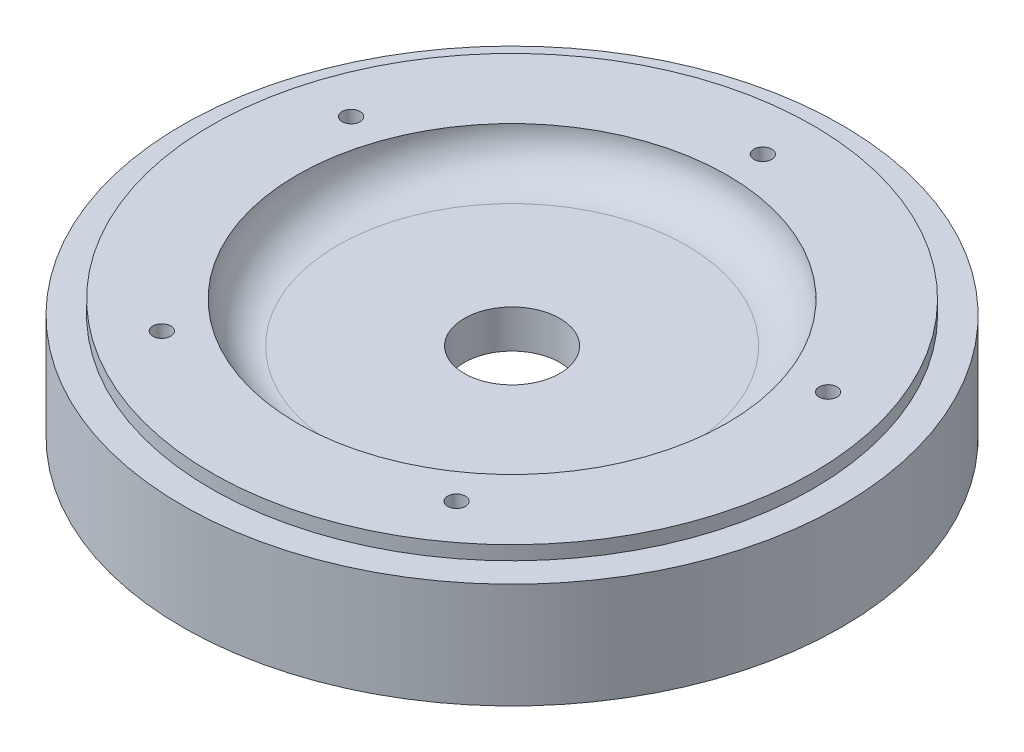
ISO-10303-21;
HEADER;
FILE_DESCRIPTION(('STEP AP214'),'2;1');
FILE_NAME('part.step','',(''),(''),'','','');
FILE_SCHEMA(('AUTOMOTIVE_DESIGN { 1 0 10303 214 1 1 1 1 }'));
ENDSEC;
DATA;
#1=APPLICATION_CONTEXT('core data for automotive mechanical design processes');
#2=APPLICATION_PROTOCOL_DEFINITION('international standard','automotive_design',2000,#1);
#3=PRODUCT_CONTEXT('',#1,'mechanical');
#4=PRODUCT('Part','Part','',(#3));
#5=PRODUCT_RELATED_PRODUCT_CATEGORY('part','',(#4));
#6=PRODUCT_DEFINITION_FORMATION('','',#4);
#7=PRODUCT_DEFINITION_CONTEXT('part definition',#1,'design');
#8=PRODUCT_DEFINITION('design','',#6,#7);
#9=PRODUCT_DEFINITION_SHAPE('','',#8);
#10=(LENGTH_UNIT() NAMED_UNIT(*) SI_UNIT(.MILLI.,.METRE.));
#11=(NAMED_UNIT(*) PLANE_ANGLE_UNIT() SI_UNIT($,.RADIAN.));
#12=(NAMED_UNIT(*) SI_UNIT($,.STERADIAN.) SOLID_ANGLE_UNIT());
#13=UNCERTAINTY_MEASURE_WITH_UNIT(LENGTH_MEASURE(1.E-05),#10,'distance_accuracy_value','');
#14=(GEOMETRIC_REPRESENTATION_CONTEXT(3) GLOBAL_UNCERTAINTY_ASSIGNED_CONTEXT((#13)) GLOBAL_UNIT_ASSIGNED_CONTEXT((#10,
#11,#12)) REPRESENTATION_CONTEXT('',''));
#15=CARTESIAN_POINT('',(0.,0.,0.));
#16=DIRECTION('',(0.,0.,1.));
#17=DIRECTION('',(1.,0.,0.));
#18=AXIS2_PLACEMENT_3D('',#15,#16,#17);
#19=CARTESIAN_POINT('',(0.,10.795,0.));
#20=DIRECTION('',(0.,-1.,0.));
#21=DIRECTION('',(1.,0.,0.));
#22=AXIS2_PLACEMENT_3D('',#19,#20,#21);
#23=CYLINDRICAL_SURFACE('',#22,87.63);
#24=CARTESIAN_POINT('',(0.,28.0416,0.));
#25=DIRECTION('',(0.,-1.,0.));
#26=DIRECTION('',(1.,0.,0.));
#27=AXIS2_PLACEMENT_3D('',#24,#25,#26);
#28=CIRCLE('',#27,87.63);
#29=CARTESIAN_POINT('',(87.63,28.0416,0.));
#30=VERTEX_POINT('',#29);
#31=EDGE_CURVE('E127',#30,#30,#28,.T.);
#32=ORIENTED_EDGE('',*,*,#31,.T.);
#33=EDGE_LOOP('',(#32));
#34=FACE_BOUND('',#33,.T.);
#35=CARTESIAN_POINT('',(0.,0.,0.));
#36=DIRECTION('',(0.,-1.,0.));
#37=DIRECTION('',(1.,0.,0.));
#38=AXIS2_PLACEMENT_3D('',#35,#36,#37);
#39=CIRCLE('',#38,87.63);
#40=CARTESIAN_POINT('',(87.63,0.,0.));
#41=VERTEX_POINT('',#40);
#42=EDGE_CURVE('E147',#41,#41,#39,.T.);
#43=ORIENTED_EDGE('',*,*,#42,.F.);
#44=EDGE_LOOP('',(#43));
#45=FACE_BOUND('',#44,.T.);
#46=ADVANCED_FACE('F45',(#34,#45),#23,.T.);
#47=CARTESIAN_POINT('',(87.63,0.,0.));
#48=DIRECTION('',(0.,-1.,0.));
#49=DIRECTION('',(1.,0.,0.));
#50=AXIS2_PLACEMENT_3D('',#47,#48,#49);
#51=PLANE('',#50);
#52=ORIENTED_EDGE('',*,*,#42,.T.);
#53=EDGE_LOOP('',(#52));
#54=FACE_BOUND('',#53,.T.);
#55=CARTESIAN_POINT('',(0.,0.,0.));
#56=DIRECTION('',(0.,-1.,0.));
#57=DIRECTION('',(1.,0.,0.));
#58=AXIS2_PLACEMENT_3D('',#55,#56,#57);
#59=CIRCLE('',#58,57.15);
#60=CARTESIAN_POINT('',(57.15,0.,0.));
#61=VERTEX_POINT('',#60);
#62=EDGE_CURVE('E143',#61,#61,#59,.T.);
#63=ORIENTED_EDGE('',*,*,#62,.F.);
#64=EDGE_LOOP('',(#63));
#65=FACE_BOUND('',#64,.T.);
#66=ADVANCED_FACE('F169',(#54,#65),#51,.T.);
#67=CARTESIAN_POINT('',(57.15,10.795,0.));
#68=DIRECTION('',(0.,-1.,0.));
#69=DIRECTION('',(1.,0.,0.));
#70=AXIS2_PLACEMENT_3D('',#67,#68,#69);
#71=PLANE('',#70);
#72=CARTESIAN_POINT('',(0.,10.795,0.));
#73=DIRECTION('',(0.,-1.,0.));
#74=DIRECTION('',(1.,0.,0.));
#75=AXIS2_PLACEMENT_3D('',#72,#73,#74);
#76=CIRCLE('',#75,46.355);
#77=CARTESIAN_POINT('',(46.355,10.795,0.));
#78=VERTEX_POINT('',#77);
#79=EDGE_CURVE('E54',#78,#78,#76,.T.);
#80=ORIENTED_EDGE('',*,*,#79,.T.);
#81=EDGE_LOOP('',(#80));
#82=FACE_BOUND('',#81,.T.);
#83=CARTESIAN_POINT('',(0.,10.795,0.));
#84=DIRECTION('',(0.,-1.,0.));
#85=DIRECTION('',(1.,0.,0.));
#86=AXIS2_PLACEMENT_3D('',#83,#84,#85);
#87=CIRCLE('',#86,12.7);
#88=CARTESIAN_POINT('',(12.7,10.795,0.));
#89=VERTEX_POINT('',#88);
#90=EDGE_CURVE('E123',#89,#89,#87,.T.);
#91=ORIENTED_EDGE('',*,*,#90,.F.);
#92=EDGE_LOOP('',(#91));
#93=FACE_BOUND('',#92,.T.);
#94=ADVANCED_FACE('F154',(#82,#93),#71,.T.);
#95=CARTESIAN_POINT('',(0.,20.955,0.));
#96=DIRECTION('',(0.,1.,0.));
#97=DIRECTION('',(-1.,0.,0.));
#98=AXIS2_PLACEMENT_3D('',#95,#96,#97);
#99=PLANE('',#98);
#100=CARTESIAN_POINT('',(0.,20.955,0.));
#101=DIRECTION('',(0.,1.,0.));
#102=DIRECTION('',(-1.,0.,0.));
#103=AXIS2_PLACEMENT_3D('',#100,#101,#102);
#104=CIRCLE('',#103,46.355);
#105=CARTESIAN_POINT('',(-46.355,20.955,0.));
#106=VERTEX_POINT('',#105);
#107=EDGE_CURVE('E11',#106,#106,#104,.T.);
#108=ORIENTED_EDGE('',*,*,#107,.T.);
#109=EDGE_LOOP('',(#108));
#110=FACE_BOUND('',#109,.T.);
#111=CARTESIAN_POINT('',(0.,20.955,0.));
#112=DIRECTION('',(0.,1.,0.));
#113=DIRECTION('',(0.,0.,1.));
#114=AXIS2_PLACEMENT_3D('',#111,#112,#113);
#115=CIRCLE('',#114,12.7);
#116=CARTESIAN_POINT('',(0.,20.955,12.7));
#117=VERTEX_POINT('',#116);
#118=EDGE_CURVE('E119',#117,#117,#115,.T.);
#119=ORIENTED_EDGE('',*,*,#118,.F.);
#120=EDGE_LOOP('',(#119));
#121=FACE_BOUND('',#120,.T.);
#122=ADVANCED_FACE('F180',(#110,#121),#99,.T.);
#123=CARTESIAN_POINT('',(57.15,31.75,0.));
#124=DIRECTION('',(0.,1.,0.));
#125=DIRECTION('',(-1.,0.,0.));
#126=AXIS2_PLACEMENT_3D('',#123,#124,#125);
#127=PLANE('',#126);
#128=CARTESIAN_POINT('',(-63.4116932239791,31.75,-20.6037080999503));
#129=DIRECTION('',(0.,1.,0.));
#130=DIRECTION('',(0.,0.,1.));
#131=AXIS2_PLACEMENT_3D('',#128,#129,#130);
#132=CIRCLE('',#131,2.3749);
#133=CARTESIAN_POINT('',(-63.4116932239791,31.75,-18.2288080999503));
#134=VERTEX_POINT('',#133);
#135=EDGE_CURVE('E82',#134,#134,#132,.T.);
#136=ORIENTED_EDGE('',*,*,#135,.F.);
#137=EDGE_LOOP('',(#136));
#138=FACE_BOUND('',#137,.T.);
#139=CARTESIAN_POINT('',(-39.1905816966011,31.75,53.9412080999493));
#140=DIRECTION('',(0.,1.,0.));
#141=DIRECTION('',(0.,0.,1.));
#142=AXIS2_PLACEMENT_3D('',#139,#140,#141);
#143=CIRCLE('',#142,2.3749);
#144=CARTESIAN_POINT('',(-39.1905816966011,31.75,56.3161080999493));
#145=VERTEX_POINT('',#144);
#146=EDGE_CURVE('E81',#145,#145,#143,.T.);
#147=ORIENTED_EDGE('',*,*,#146,.F.);
#148=EDGE_LOOP('',(#147));
#149=FACE_BOUND('',#148,.T.);
#150=CARTESIAN_POINT('',(39.1905816966003,31.75,53.9412080999498));
#151=DIRECTION('',(0.,1.,0.));
#152=DIRECTION('',(0.,0.,1.));
#153=AXIS2_PLACEMENT_3D('',#150,#151,#152);
#154=CIRCLE('',#153,2.3749);
#155=CARTESIAN_POINT('',(39.1905816966003,31.75,56.3161080999498));
#156=VERTEX_POINT('',#155);
#157=EDGE_CURVE('E95',#156,#156,#154,.T.);
#158=ORIENTED_EDGE('',*,*,#157,.F.);
#159=EDGE_LOOP('',(#158));
#160=FACE_BOUND('',#159,.T.);
#161=CARTESIAN_POINT('',(63.4116932239794,31.75,-20.6037080999494));
#162=DIRECTION('',(0.,1.,0.));
#163=DIRECTION('',(0.,0.,1.));
#164=AXIS2_PLACEMENT_3D('',#161,#162,#163);
#165=CIRCLE('',#164,2.3749);
#166=CARTESIAN_POINT('',(63.4116932239794,31.75,-18.2288080999494));
#167=VERTEX_POINT('',#166);
#168=EDGE_CURVE('E103',#167,#167,#165,.T.);
#169=ORIENTED_EDGE('',*,*,#168,.F.);
#170=EDGE_LOOP('',(#169));
#171=FACE_BOUND('',#170,.T.);
#172=CARTESIAN_POINT('',(0.,31.75,-66.675));
#173=DIRECTION('',(0.,1.,0.));
#174=DIRECTION('',(0.,0.,1.));
#175=AXIS2_PLACEMENT_3D('',#172,#173,#174);
#176=CIRCLE('',#175,2.3749);
#177=CARTESIAN_POINT('',(0.,31.75,-64.3001));
#178=VERTEX_POINT('',#177);
#179=EDGE_CURVE('E111',#178,#178,#176,.T.);
#180=ORIENTED_EDGE('',*,*,#179,.F.);
#181=EDGE_LOOP('',(#180));
#182=FACE_BOUND('',#181,.T.);
#183=CARTESIAN_POINT('',(0.,31.75,0.));
#184=DIRECTION('',(0.,-1.,0.));
#185=DIRECTION('',(1.,0.,0.));
#186=AXIS2_PLACEMENT_3D('',#183,#184,#185);
#187=CIRCLE('',#186,57.15);
#188=CARTESIAN_POINT('',(57.15,31.75,0.));
#189=VERTEX_POINT('',#188);
#190=EDGE_CURVE('E139',#189,#189,#187,.T.);
#191=ORIENTED_EDGE('',*,*,#190,.T.);
#192=EDGE_LOOP('',(#191));
#193=FACE_BOUND('',#192,.T.);
#194=CARTESIAN_POINT('',(0.,31.75,0.));
#195=DIRECTION('',(0.,-1.,0.));
#196=DIRECTION('',(1.,0.,0.));
#197=AXIS2_PLACEMENT_3D('',#194,#195,#196);
#198=CIRCLE('',#197,79.9973);
#199=CARTESIAN_POINT('',(79.9973,31.75,0.));
#200=VERTEX_POINT('',#199);
#201=EDGE_CURVE('E135',#200,#200,#198,.T.);
#202=ORIENTED_EDGE('',*,*,#201,.F.);
#203=EDGE_LOOP('',(#202));
#204=FACE_BOUND('',#203,.T.);
#205=ADVANCED_FACE('F182',(#138,#149,#160,#171,#182,#193,#204),#127,.T.);
#206=CARTESIAN_POINT('',(0.,10.795,0.));
#207=DIRECTION('',(0.,-1.,0.));
#208=DIRECTION('',(1.,0.,0.));
#209=AXIS2_PLACEMENT_3D('',#206,#207,#208);
#210=CYLINDRICAL_SURFACE('',#209,79.9973);
#211=ORIENTED_EDGE('',*,*,#201,.T.);
#212=EDGE_LOOP('',(#211));
#213=FACE_BOUND('',#212,.T.);
#214=CARTESIAN_POINT('',(0.,28.0416,0.));
#215=DIRECTION('',(0.,-1.,0.));
#216=DIRECTION('',(1.,0.,0.));
#217=AXIS2_PLACEMENT_3D('',#214,#215,#216);
#218=CIRCLE('',#217,79.9973);
#219=CARTESIAN_POINT('',(79.9973,28.0416,0.));
#220=VERTEX_POINT('',#219);
#221=EDGE_CURVE('E131',#220,#220,#218,.T.);
#222=ORIENTED_EDGE('',*,*,#221,.F.);
#223=EDGE_LOOP('',(#222));
#224=FACE_BOUND('',#223,.T.);
#225=ADVANCED_FACE('F186',(#213,#224),#210,.T.);
#226=CARTESIAN_POINT('',(79.9973,28.0416,0.));
#227=DIRECTION('',(0.,1.,0.));
#228=DIRECTION('',(-1.,0.,0.));
#229=AXIS2_PLACEMENT_3D('',#226,#227,#228);
#230=PLANE('',#229);
#231=ORIENTED_EDGE('',*,*,#221,.T.);
#232=EDGE_LOOP('',(#231));
#233=FACE_BOUND('',#232,.T.);
#234=ORIENTED_EDGE('',*,*,#31,.F.);
#235=EDGE_LOOP('',(#234));
#236=FACE_BOUND('',#235,.T.);
#237=ADVANCED_FACE('F190',(#233,#236),#230,.T.);
#238=CARTESIAN_POINT('',(0.,20.955,0.));
#239=DIRECTION('',(0.,1.,0.));
#240=DIRECTION('',(0.,0.,1.));
#241=AXIS2_PLACEMENT_3D('',#238,#239,#240);
#242=CYLINDRICAL_SURFACE('',#241,12.7);
#243=ORIENTED_EDGE('',*,*,#90,.T.);
#244=EDGE_LOOP('',(#243));
#245=FACE_BOUND('',#244,.T.);
#246=ORIENTED_EDGE('',*,*,#118,.T.);
#247=EDGE_LOOP('',(#246));
#248=FACE_BOUND('',#247,.T.);
#249=ADVANCED_FACE('F194',(#245,#248),#242,.F.);
#250=CARTESIAN_POINT('',(0.,22.098,-66.675));
#251=DIRECTION('',(0.,1.,0.));
#252=DIRECTION('',(0.,0.,1.));
#253=AXIS2_PLACEMENT_3D('',#250,#251,#252);
#254=CONICAL_SURFACE('',#253,2.3749,1.02974425867665);
#255=CARTESIAN_POINT('',(0.,20.6710161158714,-66.675));
#256=VERTEX_POINT('',#255);
#257=VERTEX_LOOP('',#256);
#258=FACE_BOUND('',#257,.T.);
#259=CARTESIAN_POINT('',(0.,22.098,-66.675));
#260=DIRECTION('',(0.,1.,0.));
#261=DIRECTION('',(0.,0.,1.));
#262=AXIS2_PLACEMENT_3D('',#259,#260,#261);
#263=CIRCLE('',#262,2.3749);
#264=CARTESIAN_POINT('',(0.,22.098,-64.3001));
#265=VERTEX_POINT('',#264);
#266=EDGE_CURVE('E115',#265,#265,#263,.T.);
#267=ORIENTED_EDGE('',*,*,#266,.T.);
#268=EDGE_LOOP('',(#267));
#269=FACE_BOUND('',#268,.T.);
#270=ADVANCED_FACE('F198',(#258,#269),#254,.F.);
#271=CARTESIAN_POINT('',(0.,31.75,-66.675));
#272=DIRECTION('',(0.,1.,0.));
#273=DIRECTION('',(0.,0.,1.));
#274=AXIS2_PLACEMENT_3D('',#271,#272,#273);
#275=CYLINDRICAL_SURFACE('',#274,2.3749);
#276=ORIENTED_EDGE('',*,*,#266,.F.);
#277=EDGE_LOOP('',(#276));
#278=FACE_BOUND('',#277,.T.);
#279=ORIENTED_EDGE('',*,*,#179,.T.);
#280=EDGE_LOOP('',(#279));
#281=FACE_BOUND('',#280,.T.);
#282=ADVANCED_FACE('F202',(#278,#281),#275,.F.);
#283=CARTESIAN_POINT('',(63.4116932239794,22.098,-20.6037080999494));
#284=DIRECTION('',(0.,1.,0.));
#285=DIRECTION('',(0.,0.,1.));
#286=AXIS2_PLACEMENT_3D('',#283,#284,#285);
#287=CONICAL_SURFACE('',#286,2.3749,1.02974425867665);
#288=CARTESIAN_POINT('',(63.4116932239794,20.6710161158714,-20.6037080999494));
#289=VERTEX_POINT('',#288);
#290=VERTEX_LOOP('',#289);
#291=FACE_BOUND('',#290,.T.);
#292=CARTESIAN_POINT('',(63.4116932239794,22.098,-20.6037080999494));
#293=DIRECTION('',(0.,1.,0.));
#294=DIRECTION('',(0.,0.,1.));
#295=AXIS2_PLACEMENT_3D('',#292,#293,#294);
#296=CIRCLE('',#295,2.3749);
#297=CARTESIAN_POINT('',(63.4116932239794,22.098,-18.2288080999494));
#298=VERTEX_POINT('',#297);
#299=EDGE_CURVE('E107',#298,#298,#296,.T.);
#300=ORIENTED_EDGE('',*,*,#299,.T.);
#301=EDGE_LOOP('',(#300));
#302=FACE_BOUND('',#301,.T.);
#303=ADVANCED_FACE('F205',(#291,#302),#287,.F.);
#304=CARTESIAN_POINT('',(63.4116932239794,31.75,-20.6037080999494));
#305=DIRECTION('',(0.,1.,0.));
#306=DIRECTION('',(0.,0.,1.));
#307=AXIS2_PLACEMENT_3D('',#304,#305,#306);
#308=CYLINDRICAL_SURFACE('',#307,2.3749);
#309=ORIENTED_EDGE('',*,*,#299,.F.);
#310=EDGE_LOOP('',(#309));
#311=FACE_BOUND('',#310,.T.);
#312=ORIENTED_EDGE('',*,*,#168,.T.);
#313=EDGE_LOOP('',(#312));
#314=FACE_BOUND('',#313,.T.);
#315=ADVANCED_FACE('F209',(#311,#314),#308,.F.);
#316=CARTESIAN_POINT('',(39.1905816966003,22.098,53.9412080999498));
#317=DIRECTION('',(0.,1.,0.));
#318=DIRECTION('',(0.,0.,1.));
#319=AXIS2_PLACEMENT_3D('',#316,#317,#318);
#320=CONICAL_SURFACE('',#319,2.3749,1.02974425867665);
#321=CARTESIAN_POINT('',(39.1905816966003,20.6710161158714,53.9412080999498));
#322=VERTEX_POINT('',#321);
#323=VERTEX_LOOP('',#322);
#324=FACE_BOUND('',#323,.T.);
#325=CARTESIAN_POINT('',(39.1905816966003,22.098,53.9412080999498));
#326=DIRECTION('',(0.,1.,0.));
#327=DIRECTION('',(0.,0.,1.));
#328=AXIS2_PLACEMENT_3D('',#325,#326,#327);
#329=CIRCLE('',#328,2.3749);
#330=CARTESIAN_POINT('',(39.1905816966003,22.098,56.3161080999498));
#331=VERTEX_POINT('',#330);
#332=EDGE_CURVE('E99',#331,#331,#329,.T.);
#333=ORIENTED_EDGE('',*,*,#332,.T.);
#334=EDGE_LOOP('',(#333));
#335=FACE_BOUND('',#334,.T.);
#336=ADVANCED_FACE('F212',(#324,#335),#320,.F.);
#337=CARTESIAN_POINT('',(39.1905816966003,31.75,53.9412080999498));
#338=DIRECTION('',(0.,1.,0.));
#339=DIRECTION('',(0.,0.,1.));
#340=AXIS2_PLACEMENT_3D('',#337,#338,#339);
#341=CYLINDRICAL_SURFACE('',#340,2.3749);
#342=ORIENTED_EDGE('',*,*,#332,.F.);
#343=EDGE_LOOP('',(#342));
#344=FACE_BOUND('',#343,.T.);
#345=ORIENTED_EDGE('',*,*,#157,.T.);
#346=EDGE_LOOP('',(#345));
#347=FACE_BOUND('',#346,.T.);
#348=ADVANCED_FACE('F216',(#344,#347),#341,.F.);
#349=CARTESIAN_POINT('',(-39.1905816966011,22.098,53.9412080999493));
#350=DIRECTION('',(0.,1.,0.));
#351=DIRECTION('',(0.,0.,1.));
#352=AXIS2_PLACEMENT_3D('',#349,#350,#351);
#353=CONICAL_SURFACE('',#352,2.3749,1.02974425867665);
#354=CARTESIAN_POINT('',(-39.1905816966011,20.6710161158714,53.9412080999493));
#355=VERTEX_POINT('',#354);
#356=VERTEX_LOOP('',#355);
#357=FACE_BOUND('',#356,.T.);
#358=CARTESIAN_POINT('',(-39.1905816966011,22.098,53.9412080999493));
#359=DIRECTION('',(0.,1.,0.));
#360=DIRECTION('',(0.,0.,1.));
#361=AXIS2_PLACEMENT_3D('',#358,#359,#360);
#362=CIRCLE('',#361,2.3749);
#363=CARTESIAN_POINT('',(-39.1905816966011,22.098,56.3161080999493));
#364=VERTEX_POINT('',#363);
#365=EDGE_CURVE('E87',#364,#364,#362,.T.);
#366=ORIENTED_EDGE('',*,*,#365,.T.);
#367=EDGE_LOOP('',(#366));
#368=FACE_BOUND('',#367,.T.);
#369=ADVANCED_FACE('F220',(#357,#368),#353,.F.);
#370=CARTESIAN_POINT('',(-39.1905816966011,31.75,53.9412080999493));
#371=DIRECTION('',(0.,1.,0.));
#372=DIRECTION('',(0.,0.,1.));
#373=AXIS2_PLACEMENT_3D('',#370,#371,#372);
#374=CYLINDRICAL_SURFACE('',#373,2.3749);
#375=ORIENTED_EDGE('',*,*,#365,.F.);
#376=EDGE_LOOP('',(#375));
#377=FACE_BOUND('',#376,.T.);
#378=ORIENTED_EDGE('',*,*,#146,.T.);
#379=EDGE_LOOP('',(#378));
#380=FACE_BOUND('',#379,.T.);
#381=ADVANCED_FACE('F74',(#377,#380),#374,.F.);
#382=CARTESIAN_POINT('',(-63.4116932239791,22.098,-20.6037080999503));
#383=DIRECTION('',(0.,1.,0.));
#384=DIRECTION('',(0.,0.,1.));
#385=AXIS2_PLACEMENT_3D('',#382,#383,#384);
#386=CONICAL_SURFACE('',#385,2.3749,1.02974425867665);
#387=CARTESIAN_POINT('',(-63.4116932239791,20.6710161158714,-20.6037080999503));
#388=VERTEX_POINT('',#387);
#389=VERTEX_LOOP('',#388);
#390=FACE_BOUND('',#389,.T.);
#391=CARTESIAN_POINT('',(-63.4116932239791,22.098,-20.6037080999503));
#392=DIRECTION('',(0.,1.,0.));
#393=DIRECTION('',(0.,0.,1.));
#394=AXIS2_PLACEMENT_3D('',#391,#392,#393);
#395=CIRCLE('',#394,2.3749);
#396=CARTESIAN_POINT('',(-63.4116932239791,22.098,-18.2288080999503));
#397=VERTEX_POINT('',#396);
#398=EDGE_CURVE('E78',#397,#397,#395,.T.);
#399=ORIENTED_EDGE('',*,*,#398,.T.);
#400=EDGE_LOOP('',(#399));
#401=FACE_BOUND('',#400,.T.);
#402=ADVANCED_FACE('F70',(#390,#401),#386,.F.);
#403=CARTESIAN_POINT('',(-63.4116932239791,31.75,-20.6037080999503));
#404=DIRECTION('',(0.,1.,0.));
#405=DIRECTION('',(0.,0.,1.));
#406=AXIS2_PLACEMENT_3D('',#403,#404,#405);
#407=CYLINDRICAL_SURFACE('',#406,2.3749);
#408=ORIENTED_EDGE('',*,*,#398,.F.);
#409=EDGE_LOOP('',(#408));
#410=FACE_BOUND('',#409,.T.);
#411=ORIENTED_EDGE('',*,*,#135,.T.);
#412=EDGE_LOOP('',(#411));
#413=FACE_BOUND('',#412,.T.);
#414=ADVANCED_FACE('F73',(#410,#413),#407,.F.);
#415=CARTESIAN_POINT('',(0.,0.,0.));
#416=DIRECTION('',(0.,-1.,0.));
#417=DIRECTION('',(1.,0.,0.));
#418=AXIS2_PLACEMENT_3D('',#415,#416,#417);
#419=TOROIDAL_SURFACE('',#418,46.355,10.795);
#420=ORIENTED_EDGE('',*,*,#62,.T.);
#421=EDGE_LOOP('',(#420));
#422=FACE_BOUND('',#421,.T.);
#423=ORIENTED_EDGE('',*,*,#79,.F.);
#424=EDGE_LOOP('',(#423));
#425=FACE_BOUND('',#424,.T.);
#426=ADVANCED_FACE('F157',(#422,#425),#419,.F.);
#427=CARTESIAN_POINT('',(0.,31.75,0.));
#428=DIRECTION('',(0.,1.,0.));
#429=DIRECTION('',(-1.,0.,0.));
#430=AXIS2_PLACEMENT_3D('',#427,#428,#429);
#431=TOROIDAL_SURFACE('',#430,46.355,10.795);
#432=ORIENTED_EDGE('',*,*,#107,.F.);
#433=EDGE_LOOP('',(#432));
#434=FACE_BOUND('',#433,.T.);
#435=ORIENTED_EDGE('',*,*,#190,.F.);
#436=EDGE_LOOP('',(#435));
#437=FACE_BOUND('',#436,.T.);
#438=ADVANCED_FACE('F47',(#434,#437),#431,.F.);
#439=CLOSED_SHELL('',(#46,#66,#94,#122,#205,#225,#237,#249,#270,#282,#303,#315,#336,#348,#369,
#381,#402,#414,#426,#438));
#440=MANIFOLD_SOLID_BREP('B2',#439);
#441=ADVANCED_BREP_SHAPE_REPRESENTATION('',(#18,#440),#14);
#442=SHAPE_DEFINITION_REPRESENTATION(#9,#441);
ENDSEC;
END-ISO-10303-21;
